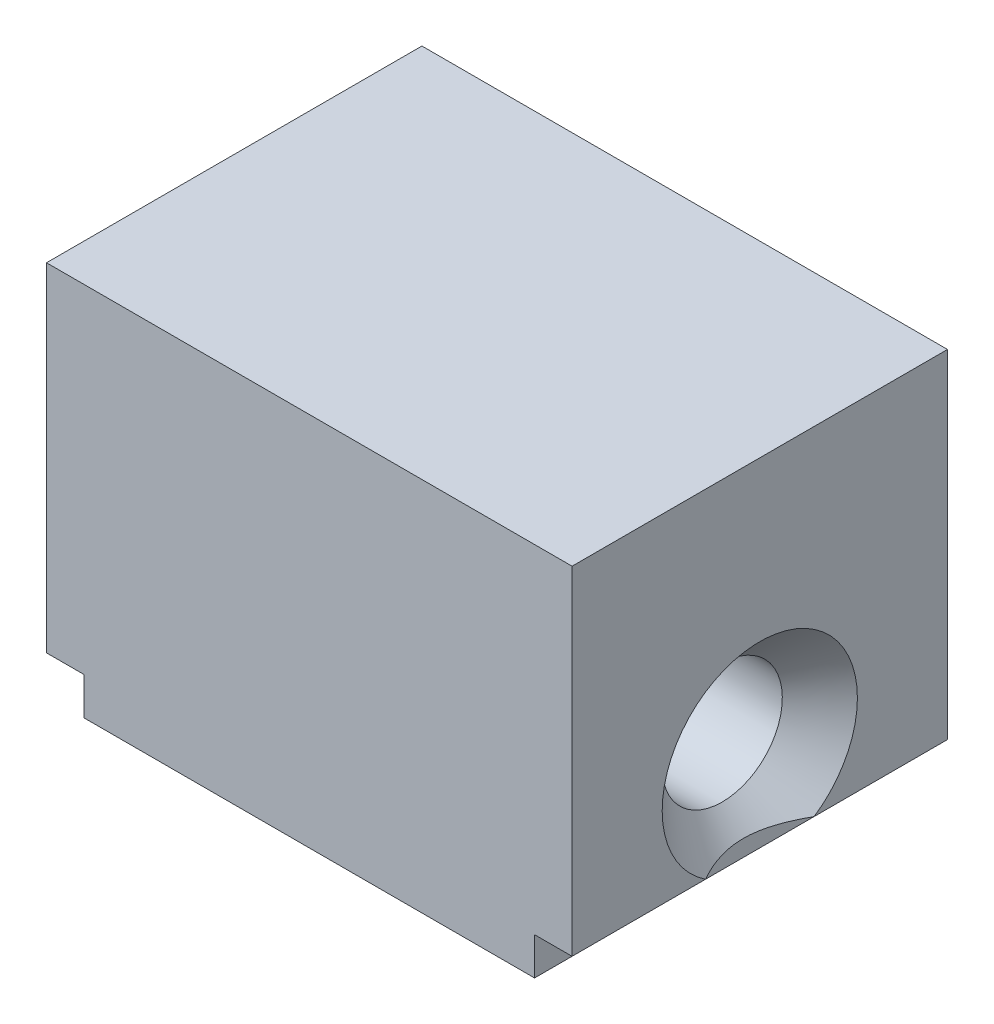
ISO-10303-21;
HEADER;
FILE_DESCRIPTION(('STEP AP214'),'2;1');
FILE_NAME('part.step','',(''),(''),'','','');
FILE_SCHEMA(('AUTOMOTIVE_DESIGN { 1 0 10303 214 1 1 1 1 }'));
ENDSEC;
DATA;
#1=APPLICATION_CONTEXT('core data for automotive mechanical design processes');
#2=APPLICATION_PROTOCOL_DEFINITION('international standard','automotive_design',2000,#1);
#3=PRODUCT_CONTEXT('',#1,'mechanical');
#4=PRODUCT('Part','Part','',(#3));
#5=PRODUCT_RELATED_PRODUCT_CATEGORY('part','',(#4));
#6=PRODUCT_DEFINITION_FORMATION('','',#4);
#7=PRODUCT_DEFINITION_CONTEXT('part definition',#1,'design');
#8=PRODUCT_DEFINITION('design','',#6,#7);
#9=PRODUCT_DEFINITION_SHAPE('','',#8);
#10=(LENGTH_UNIT() NAMED_UNIT(*) SI_UNIT(.MILLI.,.METRE.));
#11=(NAMED_UNIT(*) PLANE_ANGLE_UNIT() SI_UNIT($,.RADIAN.));
#12=(NAMED_UNIT(*) SI_UNIT($,.STERADIAN.) SOLID_ANGLE_UNIT());
#13=UNCERTAINTY_MEASURE_WITH_UNIT(LENGTH_MEASURE(1.E-05),#10,'distance_accuracy_value','');
#14=(GEOMETRIC_REPRESENTATION_CONTEXT(3) GLOBAL_UNCERTAINTY_ASSIGNED_CONTEXT((#13)) GLOBAL_UNIT_ASSIGNED_CONTEXT((#10,
#11,#12)) REPRESENTATION_CONTEXT('',''));
#15=CARTESIAN_POINT('',(0.,0.,0.));
#16=DIRECTION('',(0.,0.,1.));
#17=DIRECTION('',(1.,0.,0.));
#18=AXIS2_PLACEMENT_3D('',#15,#16,#17);
#19=CARTESIAN_POINT('',(3.,0.5,-2.5));
#20=DIRECTION('',(-1.,0.,0.));
#21=DIRECTION('',(0.,0.,1.));
#22=AXIS2_PLACEMENT_3D('',#19,#20,#21);
#23=PLANE('',#22);
#24=DIRECTION('',(0.,0.,-1.));
#25=VECTOR('',#24,1.);
#26=CARTESIAN_POINT('',(3.,0.,-2.5));
#27=LINE('',#26,#25);
#28=CARTESIAN_POINT('',(3.,0.,2.5));
#29=VERTEX_POINT('',#28);
#30=CARTESIAN_POINT('',(3.,0.,-2.5));
#31=VERTEX_POINT('',#30);
#32=EDGE_CURVE('E152',#29,#31,#27,.T.);
#33=ORIENTED_EDGE('',*,*,#32,.T.);
#34=DIRECTION('',(0.,-1.,0.));
#35=VECTOR('',#34,1.);
#36=CARTESIAN_POINT('',(3.,0.5,-2.5));
#37=LINE('',#36,#35);
#38=CARTESIAN_POINT('',(3.,0.5,-2.5));
#39=VERTEX_POINT('',#38);
#40=EDGE_CURVE('E191',#39,#31,#37,.T.);
#41=ORIENTED_EDGE('',*,*,#40,.F.);
#42=DIRECTION('',(0.,0.,-1.));
#43=VECTOR('',#42,1.);
#44=CARTESIAN_POINT('',(3.,0.5,-2.5));
#45=LINE('',#44,#43);
#46=CARTESIAN_POINT('',(3.,0.5,2.5));
#47=VERTEX_POINT('',#46);
#48=EDGE_CURVE('E163',#47,#39,#45,.T.);
#49=ORIENTED_EDGE('',*,*,#48,.F.);
#50=DIRECTION('',(0.,-1.,0.));
#51=VECTOR('',#50,1.);
#52=CARTESIAN_POINT('',(3.,0.5,2.5));
#53=LINE('',#52,#51);
#54=EDGE_CURVE('E171',#47,#29,#53,.T.);
#55=ORIENTED_EDGE('',*,*,#54,.T.);
#56=EDGE_LOOP('',(#33,#41,#49,#55));
#57=FACE_BOUND('',#56,.T.);
#58=ADVANCED_FACE('F39',(#57),#23,.F.);
#59=CARTESIAN_POINT('',(-3.,0.5,-2.5));
#60=DIRECTION('',(0.,0.,1.));
#61=DIRECTION('',(1.,0.,0.));
#62=AXIS2_PLACEMENT_3D('',#59,#60,#61);
#63=PLANE('',#62);
#64=DIRECTION('',(-1.,0.,0.));
#65=VECTOR('',#64,1.);
#66=CARTESIAN_POINT('',(-3.,0.,-2.5));
#67=LINE('',#66,#65);
#68=CARTESIAN_POINT('',(-3.,0.,-2.5));
#69=VERTEX_POINT('',#68);
#70=EDGE_CURVE('E157',#31,#69,#67,.T.);
#71=ORIENTED_EDGE('',*,*,#70,.T.);
#72=DIRECTION('',(0.,-1.,0.));
#73=VECTOR('',#72,1.);
#74=CARTESIAN_POINT('',(-3.,0.5,-2.5));
#75=LINE('',#74,#73);
#76=CARTESIAN_POINT('',(-3.,0.5,-2.5));
#77=VERTEX_POINT('',#76);
#78=EDGE_CURVE('E187',#77,#69,#75,.T.);
#79=ORIENTED_EDGE('',*,*,#78,.F.);
#80=DIRECTION('',(-1.,0.,0.));
#81=VECTOR('',#80,1.);
#82=CARTESIAN_POINT('',(-3.5,0.5,-2.5));
#83=LINE('',#82,#81);
#84=CARTESIAN_POINT('',(-3.5,0.5,-2.5));
#85=VERTEX_POINT('',#84);
#86=EDGE_CURVE('E345',#77,#85,#83,.T.);
#87=ORIENTED_EDGE('',*,*,#86,.T.);
#88=DIRECTION('',(0.,-1.,0.));
#89=VECTOR('',#88,1.);
#90=CARTESIAN_POINT('',(-3.5,5.,-2.5));
#91=LINE('',#90,#89);
#92=CARTESIAN_POINT('',(-3.5,5.,-2.5));
#93=VERTEX_POINT('',#92);
#94=EDGE_CURVE('E128',#93,#85,#91,.T.);
#95=ORIENTED_EDGE('',*,*,#94,.F.);
#96=DIRECTION('',(-1.,0.,0.));
#97=VECTOR('',#96,1.);
#98=CARTESIAN_POINT('',(-3.5,5.,-2.5));
#99=LINE('',#98,#97);
#100=CARTESIAN_POINT('',(3.5,5.,-2.5));
#101=VERTEX_POINT('',#100);
#102=EDGE_CURVE('E121',#101,#93,#99,.T.);
#103=ORIENTED_EDGE('',*,*,#102,.F.);
#104=DIRECTION('',(0.,-1.,0.));
#105=VECTOR('',#104,1.);
#106=CARTESIAN_POINT('',(3.5,5.,-2.5));
#107=LINE('',#106,#105);
#108=CARTESIAN_POINT('',(3.5,0.5,-2.5));
#109=VERTEX_POINT('',#108);
#110=EDGE_CURVE('E126',#101,#109,#107,.T.);
#111=ORIENTED_EDGE('',*,*,#110,.T.);
#112=EDGE_CURVE('E340',#109,#39,#83,.T.);
#113=ORIENTED_EDGE('',*,*,#112,.T.);
#114=ORIENTED_EDGE('',*,*,#40,.T.);
#115=EDGE_LOOP('',(#71,#79,#87,#95,#103,#111,#113,#114));
#116=FACE_BOUND('',#115,.T.);
#117=ADVANCED_FACE('F123',(#116),#63,.F.);
#118=CARTESIAN_POINT('',(-3.,0.5,-2.5));
#119=DIRECTION('',(1.,0.,0.));
#120=DIRECTION('',(0.,0.,-1.));
#121=AXIS2_PLACEMENT_3D('',#118,#119,#120);
#122=PLANE('',#121);
#123=DIRECTION('',(0.,0.,1.));
#124=VECTOR('',#123,1.);
#125=CARTESIAN_POINT('',(-3.,0.,-2.5));
#126=LINE('',#125,#124);
#127=CARTESIAN_POINT('',(-3.,0.,2.5));
#128=VERTEX_POINT('',#127);
#129=EDGE_CURVE('E175',#69,#128,#126,.T.);
#130=ORIENTED_EDGE('',*,*,#129,.T.);
#131=DIRECTION('',(0.,-1.,0.));
#132=VECTOR('',#131,1.);
#133=CARTESIAN_POINT('',(-3.,0.5,2.5));
#134=LINE('',#133,#132);
#135=CARTESIAN_POINT('',(-3.,0.5,2.5));
#136=VERTEX_POINT('',#135);
#137=EDGE_CURVE('E183',#136,#128,#134,.T.);
#138=ORIENTED_EDGE('',*,*,#137,.F.);
#139=DIRECTION('',(0.,0.,1.));
#140=VECTOR('',#139,1.);
#141=CARTESIAN_POINT('',(-3.,0.5,-2.5));
#142=LINE('',#141,#140);
#143=EDGE_CURVE('E167',#77,#136,#142,.T.);
#144=ORIENTED_EDGE('',*,*,#143,.F.);
#145=ORIENTED_EDGE('',*,*,#78,.T.);
#146=EDGE_LOOP('',(#130,#138,#144,#145));
#147=FACE_BOUND('',#146,.T.);
#148=ADVANCED_FACE('F222',(#147),#122,.F.);
#149=CARTESIAN_POINT('',(-3.,0.5,2.5));
#150=DIRECTION('',(0.,0.,-1.));
#151=DIRECTION('',(-1.,0.,0.));
#152=AXIS2_PLACEMENT_3D('',#149,#150,#151);
#153=PLANE('',#152);
#154=DIRECTION('',(1.,0.,0.));
#155=VECTOR('',#154,1.);
#156=CARTESIAN_POINT('',(-3.,0.,2.5));
#157=LINE('',#156,#155);
#158=EDGE_CURVE('E168',#128,#29,#157,.T.);
#159=ORIENTED_EDGE('',*,*,#158,.T.);
#160=ORIENTED_EDGE('',*,*,#54,.F.);
#161=DIRECTION('',(1.,0.,0.));
#162=VECTOR('',#161,1.);
#163=CARTESIAN_POINT('',(-3.5,0.5,2.5));
#164=LINE('',#163,#162);
#165=CARTESIAN_POINT('',(3.5,0.5,2.5));
#166=VERTEX_POINT('',#165);
#167=EDGE_CURVE('E245',#47,#166,#164,.T.);
#168=ORIENTED_EDGE('',*,*,#167,.T.);
#169=DIRECTION('',(0.,-1.,0.));
#170=VECTOR('',#169,1.);
#171=CARTESIAN_POINT('',(3.5,5.,2.5));
#172=LINE('',#171,#170);
#173=CARTESIAN_POINT('',(3.5,5.,2.5));
#174=VERTEX_POINT('',#173);
#175=EDGE_CURVE('E354',#174,#166,#172,.T.);
#176=ORIENTED_EDGE('',*,*,#175,.F.);
#177=DIRECTION('',(1.,0.,0.));
#178=VECTOR('',#177,1.);
#179=CARTESIAN_POINT('',(-3.5,5.,2.5));
#180=LINE('',#179,#178);
#181=CARTESIAN_POINT('',(-3.5,5.,2.5));
#182=VERTEX_POINT('',#181);
#183=EDGE_CURVE('E138',#182,#174,#180,.T.);
#184=ORIENTED_EDGE('',*,*,#183,.F.);
#185=DIRECTION('',(0.,-1.,0.));
#186=VECTOR('',#185,1.);
#187=CARTESIAN_POINT('',(-3.5,5.,2.5));
#188=LINE('',#187,#186);
#189=CARTESIAN_POINT('',(-3.5,0.5,2.5));
#190=VERTEX_POINT('',#189);
#191=EDGE_CURVE('E159',#182,#190,#188,.T.);
#192=ORIENTED_EDGE('',*,*,#191,.T.);
#193=EDGE_CURVE('E143',#190,#136,#164,.T.);
#194=ORIENTED_EDGE('',*,*,#193,.T.);
#195=ORIENTED_EDGE('',*,*,#137,.T.);
#196=EDGE_LOOP('',(#159,#160,#168,#176,#184,#192,#194,#195));
#197=FACE_BOUND('',#196,.T.);
#198=ADVANCED_FACE('F225',(#197),#153,.F.);
#199=CARTESIAN_POINT('',(0.,0.,0.));
#200=DIRECTION('',(0.,1.,0.));
#201=DIRECTION('',(0.,0.,1.));
#202=AXIS2_PLACEMENT_3D('',#199,#200,#201);
#203=PLANE('',#202);
#204=ORIENTED_EDGE('',*,*,#32,.F.);
#205=ORIENTED_EDGE('',*,*,#158,.F.);
#206=ORIENTED_EDGE('',*,*,#129,.F.);
#207=ORIENTED_EDGE('',*,*,#70,.F.);
#208=EDGE_LOOP('',(#204,#205,#206,#207));
#209=FACE_BOUND('',#208,.T.);
#210=ADVANCED_FACE('F229',(#209),#203,.F.);
#211=CARTESIAN_POINT('',(0.,0.5,0.));
#212=DIRECTION('',(0.,-1.,0.));
#213=DIRECTION('',(0.,0.,-1.));
#214=AXIS2_PLACEMENT_3D('',#211,#212,#213);
#215=PLANE('',#214);
#216=DIRECTION('',(0.,0.,-1.));
#217=VECTOR('',#216,1.);
#218=CARTESIAN_POINT('',(3.5,0.5,2.5));
#219=LINE('',#218,#217);
#220=CARTESIAN_POINT('',(3.5,0.5,-0.723602100605023));
#221=VERTEX_POINT('',#220);
#222=EDGE_CURVE('E149',#221,#109,#219,.T.);
#223=ORIENTED_EDGE('',*,*,#222,.F.);
#224=CARTESIAN_POINT('',(3.5,0.5,-0.723602100605023));
#225=CARTESIAN_POINT('',(3.47856687928063,0.5,-0.685039533998081));
#226=CARTESIAN_POINT('',(3.45799700577048,0.5,-0.646006901532781));
#227=CARTESIAN_POINT('',(3.41912062776124,0.5,-0.566639783998303));
#228=CARTESIAN_POINT('',(3.40082369728594,0.5,-0.526300638310947));
#229=CARTESIAN_POINT('',(3.35013879452994,0.5,-0.402591072974549));
#230=CARTESIAN_POINT('',(3.32232563261118,0.5,-0.317148275129609));
#231=CARTESIAN_POINT('',(3.29094418799593,0.5,-0.166107175464404));
#232=CARTESIAN_POINT('',(3.28281885997334,0.5,-0.1014923348696));
#233=CARTESIAN_POINT('',(3.27843948171255,0.5,0.027750359284501));
#234=CARTESIAN_POINT('',(3.28210862193313,0.5,0.0923753990414811));
#235=CARTESIAN_POINT('',(3.30256679090434,0.5,0.235414874133467));
#236=CARTESIAN_POINT('',(3.322314238145,0.5,0.313384284795315));
#237=CARTESIAN_POINT('',(3.37382637152783,0.5,0.465501301179838));
#238=CARTESIAN_POINT('',(3.40566478504021,0.5,0.539622222873332));
#239=CARTESIAN_POINT('',(3.4505821121499,0.5,0.630730789972904));
#240=CARTESIAN_POINT('',(3.46017805233087,0.5,0.649537557182324));
#241=CARTESIAN_POINT('',(3.47978184370034,0.5,0.686799323366569));
#242=CARTESIAN_POINT('',(3.48978704945006,0.5,0.705255712623796));
#243=CARTESIAN_POINT('',(3.49999999999999,0.5,0.723602100605028));
#244=B_SPLINE_CURVE_WITH_KNOTS('',3,(#224,#225,#226,#227,#228,#229,#230,#231,#232,#233,#234,
#235,#236,#237,#238,#239,#240,#241,#242,#243),.UNSPECIFIED.,.F.,.F.,(4,2,2,2,2,2,2,2,2,4),(0.,
0.132308459650684,0.265156578029528,0.533002504889508,0.727397636580818,0.920529372892122,
1.16036979287796,1.40169680746693,1.46503665623533,1.52801719723665),.UNSPECIFIED.);
#245=CARTESIAN_POINT('',(3.5,0.5,0.723602100605023));
#246=VERTEX_POINT('',#245);
#247=EDGE_CURVE('E198',#221,#246,#244,.T.);
#248=ORIENTED_EDGE('',*,*,#247,.T.);
#249=EDGE_CURVE('E342',#166,#246,#219,.T.);
#250=ORIENTED_EDGE('',*,*,#249,.F.);
#251=ORIENTED_EDGE('',*,*,#167,.F.);
#252=ORIENTED_EDGE('',*,*,#48,.T.);
#253=ORIENTED_EDGE('',*,*,#112,.F.);
#254=EDGE_LOOP('',(#223,#248,#250,#251,#252,#253));
#255=FACE_BOUND('',#254,.T.);
#256=ADVANCED_FACE('F233',(#255),#215,.T.);
#257=CARTESIAN_POINT('',(3.5,5.,2.5));
#258=DIRECTION('',(-1.,0.,0.));
#259=DIRECTION('',(0.,0.,1.));
#260=AXIS2_PLACEMENT_3D('',#257,#258,#259);
#261=PLANE('',#260);
#262=ORIENTED_EDGE('',*,*,#249,.T.);
#263=CARTESIAN_POINT('',(3.5,1.58,0.));
#264=DIRECTION('',(-1.,0.,0.));
#265=DIRECTION('',(0.,0.,1.));
#266=AXIS2_PLACEMENT_3D('',#263,#264,#265);
#267=CIRCLE('',#266,1.3);
#268=EDGE_CURVE('E195',#246,#221,#267,.T.);
#269=ORIENTED_EDGE('',*,*,#268,.T.);
#270=ORIENTED_EDGE('',*,*,#222,.T.);
#271=ORIENTED_EDGE('',*,*,#110,.F.);
#272=DIRECTION('',(0.,0.,-1.));
#273=VECTOR('',#272,1.);
#274=CARTESIAN_POINT('',(3.5,5.,2.5));
#275=LINE('',#274,#273);
#276=EDGE_CURVE('E133',#174,#101,#275,.T.);
#277=ORIENTED_EDGE('',*,*,#276,.F.);
#278=ORIENTED_EDGE('',*,*,#175,.T.);
#279=EDGE_LOOP('',(#262,#269,#270,#271,#277,#278));
#280=FACE_BOUND('',#279,.T.);
#281=ADVANCED_FACE('F146',(#280),#261,.F.);
#282=CARTESIAN_POINT('',(-3.5,5.,2.5));
#283=DIRECTION('',(1.,0.,0.));
#284=DIRECTION('',(0.,0.,-1.));
#285=AXIS2_PLACEMENT_3D('',#282,#283,#284);
#286=PLANE('',#285);
#287=DIRECTION('',(0.,0.,1.));
#288=VECTOR('',#287,1.);
#289=CARTESIAN_POINT('',(-3.5,0.5,2.5));
#290=LINE('',#289,#288);
#291=CARTESIAN_POINT('',(-3.5,0.5,-0.723602100605025));
#292=VERTEX_POINT('',#291);
#293=EDGE_CURVE('E242',#85,#292,#290,.T.);
#294=ORIENTED_EDGE('',*,*,#293,.T.);
#295=CARTESIAN_POINT('',(-3.5,1.58,0.));
#296=DIRECTION('',(1.,0.,0.));
#297=DIRECTION('',(0.,0.,-1.));
#298=AXIS2_PLACEMENT_3D('',#295,#296,#297);
#299=CIRCLE('',#298,1.3);
#300=CARTESIAN_POINT('',(-3.5,0.5,0.723602100605025));
#301=VERTEX_POINT('',#300);
#302=EDGE_CURVE('E54',#292,#301,#299,.T.);
#303=ORIENTED_EDGE('',*,*,#302,.T.);
#304=EDGE_CURVE('E246',#301,#190,#290,.T.);
#305=ORIENTED_EDGE('',*,*,#304,.T.);
#306=ORIENTED_EDGE('',*,*,#191,.F.);
#307=DIRECTION('',(0.,0.,1.));
#308=VECTOR('',#307,1.);
#309=CARTESIAN_POINT('',(-3.5,5.,2.5));
#310=LINE('',#309,#308);
#311=EDGE_CURVE('E132',#93,#182,#310,.T.);
#312=ORIENTED_EDGE('',*,*,#311,.F.);
#313=ORIENTED_EDGE('',*,*,#94,.T.);
#314=EDGE_LOOP('',(#294,#303,#305,#306,#312,#313));
#315=FACE_BOUND('',#314,.T.);
#316=ADVANCED_FACE('F236',(#315),#286,.F.);
#317=CARTESIAN_POINT('',(0.,5.,0.));
#318=DIRECTION('',(0.,-1.,0.));
#319=DIRECTION('',(0.,0.,-1.));
#320=AXIS2_PLACEMENT_3D('',#317,#318,#319);
#321=PLANE('',#320);
#322=ORIENTED_EDGE('',*,*,#276,.T.);
#323=ORIENTED_EDGE('',*,*,#102,.T.);
#324=ORIENTED_EDGE('',*,*,#311,.T.);
#325=ORIENTED_EDGE('',*,*,#183,.T.);
#326=EDGE_LOOP('',(#322,#323,#324,#325));
#327=FACE_BOUND('',#326,.T.);
#328=ADVANCED_FACE('F136',(#327),#321,.F.);
#329=ORIENTED_EDGE('',*,*,#304,.F.);
#330=CARTESIAN_POINT('',(-3.5,0.5,0.723602100605025));
#331=CARTESIAN_POINT('',(-3.47856687928063,0.5,0.685039533998082));
#332=CARTESIAN_POINT('',(-3.45799700577048,0.5,0.646006901532782));
#333=CARTESIAN_POINT('',(-3.41912062776124,0.5,0.566639783998305));
#334=CARTESIAN_POINT('',(-3.40082369728594,0.5,0.526300638310948));
#335=CARTESIAN_POINT('',(-3.35013879452994,0.5,0.40259107297455));
#336=CARTESIAN_POINT('',(-3.32232563261118,0.5,0.31714827512961));
#337=CARTESIAN_POINT('',(-3.29094418799593,0.5,0.166107175464404));
#338=CARTESIAN_POINT('',(-3.28281885997334,0.5,0.1014923348696));
#339=CARTESIAN_POINT('',(-3.27843948171255,0.5,-0.0277503592845013));
#340=CARTESIAN_POINT('',(-3.28210862193313,0.5,-0.0923753990414815));
#341=CARTESIAN_POINT('',(-3.30256679090434,0.5,-0.235414874133468));
#342=CARTESIAN_POINT('',(-3.322314238145,0.5,-0.313384284795317));
#343=CARTESIAN_POINT('',(-3.37382637152783,0.5,-0.46550130117984));
#344=CARTESIAN_POINT('',(-3.40566478504021,0.5,-0.539622222873333));
#345=CARTESIAN_POINT('',(-3.4505821121499,0.5,-0.630730789972906));
#346=CARTESIAN_POINT('',(-3.46017805233087,0.5,-0.649537557182326));
#347=CARTESIAN_POINT('',(-3.47978184370034,0.5,-0.686799323366571));
#348=CARTESIAN_POINT('',(-3.48978704945006,0.5,-0.705255712623798));
#349=CARTESIAN_POINT('',(-3.49999999999999,0.5,-0.723602100605029));
#350=B_SPLINE_CURVE_WITH_KNOTS('',3,(#330,#331,#332,#333,#334,#335,#336,#337,#338,#339,#340,
#341,#342,#343,#344,#345,#346,#347,#348,#349),.UNSPECIFIED.,.F.,.F.,(4,2,2,2,2,2,2,2,2,4),(0.,
0.132308459650685,0.265156578029529,0.533002504889509,0.727397636580819,0.920529372892124,
1.16036979287796,1.40169680746694,1.46503665623533,1.52801719723665),.UNSPECIFIED.);
#351=EDGE_CURVE('E11',#301,#292,#350,.T.);
#352=ORIENTED_EDGE('',*,*,#351,.T.);
#353=ORIENTED_EDGE('',*,*,#293,.F.);
#354=ORIENTED_EDGE('',*,*,#86,.F.);
#355=ORIENTED_EDGE('',*,*,#143,.T.);
#356=ORIENTED_EDGE('',*,*,#193,.F.);
#357=EDGE_LOOP('',(#329,#352,#353,#354,#355,#356));
#358=FACE_BOUND('',#357,.T.);
#359=ADVANCED_FACE('F207',(#358),#215,.T.);
#360=CARTESIAN_POINT('',(3.5,1.58,0.));
#361=DIRECTION('',(-1.,0.,0.));
#362=DIRECTION('',(0.,0.,1.));
#363=AXIS2_PLACEMENT_3D('',#360,#361,#362);
#364=CYLINDRICAL_SURFACE('',#363,0.8);
#365=CARTESIAN_POINT('',(3.,1.58,0.));
#366=DIRECTION('',(-1.,0.,0.));
#367=DIRECTION('',(0.,0.,1.));
#368=AXIS2_PLACEMENT_3D('',#365,#366,#367);
#369=CIRCLE('',#368,0.8);
#370=CARTESIAN_POINT('',(3.,1.58,0.8));
#371=VERTEX_POINT('',#370);
#372=EDGE_CURVE('E250',#371,#371,#369,.F.);
#373=ORIENTED_EDGE('',*,*,#372,.T.);
#374=EDGE_LOOP('',(#373));
#375=FACE_BOUND('',#374,.T.);
#376=CARTESIAN_POINT('',(-3.,1.58,0.));
#377=DIRECTION('',(1.,0.,0.));
#378=DIRECTION('',(0.,0.,-1.));
#379=AXIS2_PLACEMENT_3D('',#376,#377,#378);
#380=CIRCLE('',#379,0.8);
#381=CARTESIAN_POINT('',(-3.,1.58,-0.8));
#382=VERTEX_POINT('',#381);
#383=EDGE_CURVE('E205',#382,#382,#380,.F.);
#384=ORIENTED_EDGE('',*,*,#383,.T.);
#385=EDGE_LOOP('',(#384));
#386=FACE_BOUND('',#385,.T.);
#387=ADVANCED_FACE('F215',(#375,#386),#364,.F.);
#388=CARTESIAN_POINT('',(3.5,1.58,0.));
#389=DIRECTION('',(1.,0.,0.));
#390=DIRECTION('',(0.,0.,-1.));
#391=AXIS2_PLACEMENT_3D('',#388,#389,#390);
#392=CONICAL_SURFACE('',#391,1.3,0.785398163397447);
#393=ORIENTED_EDGE('',*,*,#372,.F.);
#394=EDGE_LOOP('',(#393));
#395=FACE_BOUND('',#394,.T.);
#396=ORIENTED_EDGE('',*,*,#247,.F.);
#397=ORIENTED_EDGE('',*,*,#268,.F.);
#398=EDGE_LOOP('',(#396,#397));
#399=FACE_BOUND('',#398,.T.);
#400=ADVANCED_FACE('F211',(#395,#399),#392,.F.);
#401=CARTESIAN_POINT('',(-3.,1.58,0.));
#402=DIRECTION('',(-1.,0.,0.));
#403=DIRECTION('',(0.,0.,1.));
#404=AXIS2_PLACEMENT_3D('',#401,#402,#403);
#405=CONICAL_SURFACE('',#404,0.8,0.785398163397449);
#406=ORIENTED_EDGE('',*,*,#351,.F.);
#407=ORIENTED_EDGE('',*,*,#302,.F.);
#408=EDGE_LOOP('',(#406,#407));
#409=FACE_BOUND('',#408,.T.);
#410=ORIENTED_EDGE('',*,*,#383,.F.);
#411=EDGE_LOOP('',(#410));
#412=FACE_BOUND('',#411,.T.);
#413=ADVANCED_FACE('F41',(#409,#412),#405,.F.);
#414=CLOSED_SHELL('',(#58,#117,#148,#198,#210,#256,#281,#316,#328,#359,#387,#400,#413));
#415=MANIFOLD_SOLID_BREP('B2',#414);
#416=ADVANCED_BREP_SHAPE_REPRESENTATION('',(#18,#415),#14);
#417=SHAPE_DEFINITION_REPRESENTATION(#9,#416);
ENDSEC;
END-ISO-10303-21;
